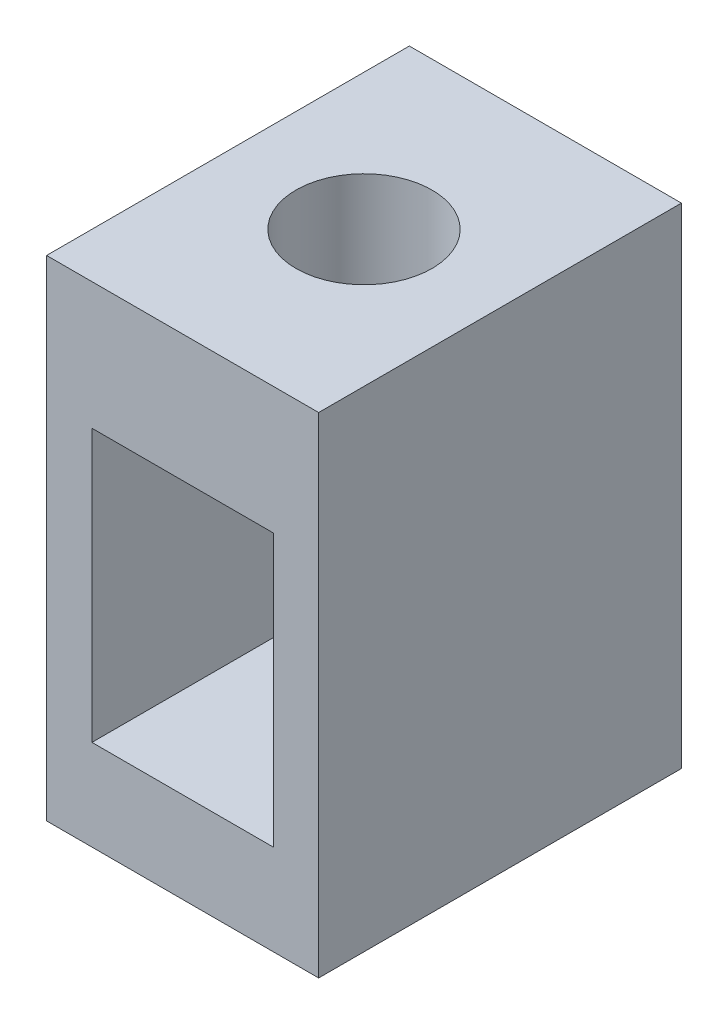
ISO-10303-21;
HEADER;
FILE_DESCRIPTION(('STEP AP214'),'2;1');
FILE_NAME('part.step','',(''),(''),'','','');
FILE_SCHEMA(('AUTOMOTIVE_DESIGN { 1 0 10303 214 1 1 1 1 }'));
ENDSEC;
DATA;
#1=APPLICATION_CONTEXT('core data for automotive mechanical design processes');
#2=APPLICATION_PROTOCOL_DEFINITION('international standard','automotive_design',2000,#1);
#3=PRODUCT_CONTEXT('',#1,'mechanical');
#4=PRODUCT('Part','Part','',(#3));
#5=PRODUCT_RELATED_PRODUCT_CATEGORY('part','',(#4));
#6=PRODUCT_DEFINITION_FORMATION('','',#4);
#7=PRODUCT_DEFINITION_CONTEXT('part definition',#1,'design');
#8=PRODUCT_DEFINITION('design','',#6,#7);
#9=PRODUCT_DEFINITION_SHAPE('','',#8);
#10=(LENGTH_UNIT() NAMED_UNIT(*) SI_UNIT(.MILLI.,.METRE.));
#11=(NAMED_UNIT(*) PLANE_ANGLE_UNIT() SI_UNIT($,.RADIAN.));
#12=(NAMED_UNIT(*) SI_UNIT($,.STERADIAN.) SOLID_ANGLE_UNIT());
#13=UNCERTAINTY_MEASURE_WITH_UNIT(LENGTH_MEASURE(1.E-05),#10,'distance_accuracy_value','');
#14=(GEOMETRIC_REPRESENTATION_CONTEXT(3) GLOBAL_UNCERTAINTY_ASSIGNED_CONTEXT((#13)) GLOBAL_UNIT_ASSIGNED_CONTEXT((#10,
#11,#12)) REPRESENTATION_CONTEXT('',''));
#15=CARTESIAN_POINT('',(0.,0.,0.));
#16=DIRECTION('',(0.,0.,1.));
#17=DIRECTION('',(1.,0.,0.));
#18=AXIS2_PLACEMENT_3D('',#15,#16,#17);
#19=CARTESIAN_POINT('',(1.5,2.7,-4.));
#20=DIRECTION('',(1.,0.,0.));
#21=DIRECTION('',(0.,1.,0.));
#22=AXIS2_PLACEMENT_3D('',#19,#20,#21);
#23=PLANE('',#22);
#24=DIRECTION('',(0.,1.,0.));
#25=VECTOR('',#24,1.);
#26=CARTESIAN_POINT('',(1.5,2.7,0.));
#27=LINE('',#26,#25);
#28=CARTESIAN_POINT('',(1.5,-2.7,0.));
#29=VERTEX_POINT('',#28);
#30=CARTESIAN_POINT('',(1.5,2.7,0.));
#31=VERTEX_POINT('',#30);
#32=EDGE_CURVE('E136',#29,#31,#27,.T.);
#33=ORIENTED_EDGE('',*,*,#32,.F.);
#34=DIRECTION('',(0.,0.,1.));
#35=VECTOR('',#34,1.);
#36=CARTESIAN_POINT('',(1.5,-2.7,-4.));
#37=LINE('',#36,#35);
#38=CARTESIAN_POINT('',(1.5,-2.7,-4.));
#39=VERTEX_POINT('',#38);
#40=EDGE_CURVE('E11',#39,#29,#37,.T.);
#41=ORIENTED_EDGE('',*,*,#40,.F.);
#42=DIRECTION('',(0.,1.,0.));
#43=VECTOR('',#42,1.);
#44=CARTESIAN_POINT('',(1.5,2.7,-4.));
#45=LINE('',#44,#43);
#46=CARTESIAN_POINT('',(1.5,2.7,-4.));
#47=VERTEX_POINT('',#46);
#48=EDGE_CURVE('E140',#39,#47,#45,.T.);
#49=ORIENTED_EDGE('',*,*,#48,.T.);
#50=DIRECTION('',(0.,0.,1.));
#51=VECTOR('',#50,1.);
#52=CARTESIAN_POINT('',(1.5,2.7,-4.));
#53=LINE('',#52,#51);
#54=EDGE_CURVE('E38',#47,#31,#53,.T.);
#55=ORIENTED_EDGE('',*,*,#54,.T.);
#56=EDGE_LOOP('',(#33,#41,#49,#55));
#57=FACE_BOUND('',#56,.T.);
#58=ADVANCED_FACE('F35',(#57),#23,.T.);
#59=CARTESIAN_POINT('',(-1.5,-2.7,-4.));
#60=DIRECTION('',(0.,-1.,0.));
#61=DIRECTION('',(0.,0.,-1.));
#62=AXIS2_PLACEMENT_3D('',#59,#60,#61);
#63=PLANE('',#62);
#64=DIRECTION('',(1.,0.,0.));
#65=VECTOR('',#64,1.);
#66=CARTESIAN_POINT('',(-1.5,-2.7,0.));
#67=LINE('',#66,#65);
#68=CARTESIAN_POINT('',(-1.5,-2.7,0.));
#69=VERTEX_POINT('',#68);
#70=EDGE_CURVE('E144',#69,#29,#67,.T.);
#71=ORIENTED_EDGE('',*,*,#70,.F.);
#72=DIRECTION('',(0.,0.,1.));
#73=VECTOR('',#72,1.);
#74=CARTESIAN_POINT('',(-1.5,-2.7,-4.));
#75=LINE('',#74,#73);
#76=CARTESIAN_POINT('',(-1.5,-2.7,-4.));
#77=VERTEX_POINT('',#76);
#78=EDGE_CURVE('E43',#77,#69,#75,.T.);
#79=ORIENTED_EDGE('',*,*,#78,.F.);
#80=DIRECTION('',(1.,0.,0.));
#81=VECTOR('',#80,1.);
#82=CARTESIAN_POINT('',(-1.5,-2.7,-4.));
#83=LINE('',#82,#81);
#84=EDGE_CURVE('E150',#77,#39,#83,.T.);
#85=ORIENTED_EDGE('',*,*,#84,.T.);
#86=ORIENTED_EDGE('',*,*,#40,.T.);
#87=EDGE_LOOP('',(#71,#79,#85,#86));
#88=FACE_BOUND('',#87,.T.);
#89=ADVANCED_FACE('F176',(#88),#63,.T.);
#90=CARTESIAN_POINT('',(-1.5,2.7,-4.));
#91=DIRECTION('',(-1.,0.,0.));
#92=DIRECTION('',(0.,-1.,0.));
#93=AXIS2_PLACEMENT_3D('',#90,#91,#92);
#94=PLANE('',#93);
#95=DIRECTION('',(0.,-1.,0.));
#96=VECTOR('',#95,1.);
#97=CARTESIAN_POINT('',(-1.5,2.7,0.));
#98=LINE('',#97,#96);
#99=CARTESIAN_POINT('',(-1.5,2.7,0.));
#100=VERTEX_POINT('',#99);
#101=EDGE_CURVE('E158',#100,#69,#98,.T.);
#102=ORIENTED_EDGE('',*,*,#101,.F.);
#103=DIRECTION('',(0.,0.,1.));
#104=VECTOR('',#103,1.);
#105=CARTESIAN_POINT('',(-1.5,2.7,-4.));
#106=LINE('',#105,#104);
#107=CARTESIAN_POINT('',(-1.5,2.7,-4.));
#108=VERTEX_POINT('',#107);
#109=EDGE_CURVE('E163',#108,#100,#106,.T.);
#110=ORIENTED_EDGE('',*,*,#109,.F.);
#111=DIRECTION('',(0.,-1.,0.));
#112=VECTOR('',#111,1.);
#113=CARTESIAN_POINT('',(-1.5,2.7,-4.));
#114=LINE('',#113,#112);
#115=EDGE_CURVE('E147',#108,#77,#114,.T.);
#116=ORIENTED_EDGE('',*,*,#115,.T.);
#117=ORIENTED_EDGE('',*,*,#78,.T.);
#118=EDGE_LOOP('',(#102,#110,#116,#117));
#119=FACE_BOUND('',#118,.T.);
#120=ADVANCED_FACE('F180',(#119),#94,.T.);
#121=CARTESIAN_POINT('',(-1.5,2.7,-4.));
#122=DIRECTION('',(0.,1.,0.));
#123=DIRECTION('',(0.,0.,1.));
#124=AXIS2_PLACEMENT_3D('',#121,#122,#123);
#125=PLANE('',#124);
#126=CARTESIAN_POINT('',(0.,2.7,-2.));
#127=DIRECTION('',(0.,1.,0.));
#128=DIRECTION('',(0.,0.,1.));
#129=AXIS2_PLACEMENT_3D('',#126,#127,#128);
#130=CIRCLE('',#129,0.75);
#131=CARTESIAN_POINT('',(0.,2.7,-1.25));
#132=VERTEX_POINT('',#131);
#133=EDGE_CURVE('E275',#132,#132,#130,.T.);
#134=ORIENTED_EDGE('',*,*,#133,.F.);
#135=EDGE_LOOP('',(#134));
#136=FACE_BOUND('',#135,.T.);
#137=DIRECTION('',(-1.,0.,0.));
#138=VECTOR('',#137,1.);
#139=CARTESIAN_POINT('',(-1.5,2.7,0.));
#140=LINE('',#139,#138);
#141=EDGE_CURVE('E155',#31,#100,#140,.T.);
#142=ORIENTED_EDGE('',*,*,#141,.F.);
#143=ORIENTED_EDGE('',*,*,#54,.F.);
#144=DIRECTION('',(-1.,0.,0.));
#145=VECTOR('',#144,1.);
#146=CARTESIAN_POINT('',(-1.5,2.7,-4.));
#147=LINE('',#146,#145);
#148=EDGE_CURVE('E143',#47,#108,#147,.T.);
#149=ORIENTED_EDGE('',*,*,#148,.T.);
#150=ORIENTED_EDGE('',*,*,#109,.T.);
#151=EDGE_LOOP('',(#142,#143,#149,#150));
#152=FACE_BOUND('',#151,.T.);
#153=ADVANCED_FACE('F171',(#136,#152),#125,.T.);
#154=CARTESIAN_POINT('',(0.,0.,-4.));
#155=DIRECTION('',(0.,0.,1.));
#156=DIRECTION('',(1.,0.,0.));
#157=AXIS2_PLACEMENT_3D('',#154,#155,#156);
#158=PLANE('',#157);
#159=DIRECTION('',(-1.,0.,0.));
#160=VECTOR('',#159,1.);
#161=CARTESIAN_POINT('',(-1.,1.3,-4.));
#162=LINE('',#161,#160);
#163=CARTESIAN_POINT('',(0.999999999999999,1.3,-4.));
#164=VERTEX_POINT('',#163);
#165=CARTESIAN_POINT('',(-1.,1.3,-4.));
#166=VERTEX_POINT('',#165);
#167=EDGE_CURVE('E108',#164,#166,#162,.T.);
#168=ORIENTED_EDGE('',*,*,#167,.T.);
#169=DIRECTION('',(0.,-1.,0.));
#170=VECTOR('',#169,1.);
#171=CARTESIAN_POINT('',(-1.,1.3,-4.));
#172=LINE('',#171,#170);
#173=CARTESIAN_POINT('',(-1.,-1.7,-4.));
#174=VERTEX_POINT('',#173);
#175=EDGE_CURVE('E102',#166,#174,#172,.T.);
#176=ORIENTED_EDGE('',*,*,#175,.T.);
#177=DIRECTION('',(1.,0.,0.));
#178=VECTOR('',#177,1.);
#179=CARTESIAN_POINT('',(-1.,-1.7,-4.));
#180=LINE('',#179,#178);
#181=CARTESIAN_POINT('',(1.,-1.7,-4.));
#182=VERTEX_POINT('',#181);
#183=EDGE_CURVE('E111',#174,#182,#180,.T.);
#184=ORIENTED_EDGE('',*,*,#183,.T.);
#185=DIRECTION('',(0.,1.,0.));
#186=VECTOR('',#185,1.);
#187=CARTESIAN_POINT('',(0.999999999999999,1.3,-4.));
#188=LINE('',#187,#186);
#189=EDGE_CURVE('E51',#182,#164,#188,.T.);
#190=ORIENTED_EDGE('',*,*,#189,.T.);
#191=EDGE_LOOP('',(#168,#176,#184,#190));
#192=FACE_BOUND('',#191,.T.);
#193=ORIENTED_EDGE('',*,*,#48,.F.);
#194=ORIENTED_EDGE('',*,*,#84,.F.);
#195=ORIENTED_EDGE('',*,*,#115,.F.);
#196=ORIENTED_EDGE('',*,*,#148,.F.);
#197=EDGE_LOOP('',(#193,#194,#195,#196));
#198=FACE_BOUND('',#197,.T.);
#199=ADVANCED_FACE('F115',(#192,#198),#158,.F.);
#200=CARTESIAN_POINT('',(0.,0.,0.));
#201=DIRECTION('',(0.,0.,1.));
#202=DIRECTION('',(1.,0.,0.));
#203=AXIS2_PLACEMENT_3D('',#200,#201,#202);
#204=PLANE('',#203);
#205=DIRECTION('',(0.,-1.,0.));
#206=VECTOR('',#205,1.);
#207=CARTESIAN_POINT('',(-1.,1.3,0.));
#208=LINE('',#207,#206);
#209=CARTESIAN_POINT('',(-1.,1.3,0.));
#210=VERTEX_POINT('',#209);
#211=CARTESIAN_POINT('',(-1.,-1.7,0.));
#212=VERTEX_POINT('',#211);
#213=EDGE_CURVE('E59',#210,#212,#208,.T.);
#214=ORIENTED_EDGE('',*,*,#213,.F.);
#215=DIRECTION('',(-1.,0.,0.));
#216=VECTOR('',#215,1.);
#217=CARTESIAN_POINT('',(-1.,1.3,0.));
#218=LINE('',#217,#216);
#219=CARTESIAN_POINT('',(0.999999999999999,1.3,0.));
#220=VERTEX_POINT('',#219);
#221=EDGE_CURVE('E118',#220,#210,#218,.T.);
#222=ORIENTED_EDGE('',*,*,#221,.F.);
#223=DIRECTION('',(0.,1.,0.));
#224=VECTOR('',#223,1.);
#225=CARTESIAN_POINT('',(0.999999999999999,1.3,0.));
#226=LINE('',#225,#224);
#227=CARTESIAN_POINT('',(1.,-1.7,0.));
#228=VERTEX_POINT('',#227);
#229=EDGE_CURVE('E121',#228,#220,#226,.T.);
#230=ORIENTED_EDGE('',*,*,#229,.F.);
#231=DIRECTION('',(1.,0.,0.));
#232=VECTOR('',#231,1.);
#233=CARTESIAN_POINT('',(-1.,-1.7,0.));
#234=LINE('',#233,#232);
#235=EDGE_CURVE('E130',#212,#228,#234,.T.);
#236=ORIENTED_EDGE('',*,*,#235,.F.);
#237=EDGE_LOOP('',(#214,#222,#230,#236));
#238=FACE_BOUND('',#237,.T.);
#239=ORIENTED_EDGE('',*,*,#32,.T.);
#240=ORIENTED_EDGE('',*,*,#141,.T.);
#241=ORIENTED_EDGE('',*,*,#101,.T.);
#242=ORIENTED_EDGE('',*,*,#70,.T.);
#243=EDGE_LOOP('',(#239,#240,#241,#242));
#244=FACE_BOUND('',#243,.T.);
#245=ADVANCED_FACE('F173',(#238,#244),#204,.T.);
#246=CARTESIAN_POINT('',(-1.,1.3,-4.));
#247=DIRECTION('',(-1.,0.,0.));
#248=DIRECTION('',(0.,-1.,0.));
#249=AXIS2_PLACEMENT_3D('',#246,#247,#248);
#250=PLANE('',#249);
#251=ORIENTED_EDGE('',*,*,#213,.T.);
#252=DIRECTION('',(0.,0.,1.));
#253=VECTOR('',#252,1.);
#254=CARTESIAN_POINT('',(-1.,-1.7,-4.));
#255=LINE('',#254,#253);
#256=EDGE_CURVE('E98',#174,#212,#255,.T.);
#257=ORIENTED_EDGE('',*,*,#256,.F.);
#258=ORIENTED_EDGE('',*,*,#175,.F.);
#259=DIRECTION('',(0.,0.,1.));
#260=VECTOR('',#259,1.);
#261=CARTESIAN_POINT('',(-1.,1.3,-4.));
#262=LINE('',#261,#260);
#263=EDGE_CURVE('E134',#166,#210,#262,.T.);
#264=ORIENTED_EDGE('',*,*,#263,.T.);
#265=EDGE_LOOP('',(#251,#257,#258,#264));
#266=FACE_BOUND('',#265,.T.);
#267=ADVANCED_FACE('F100',(#266),#250,.F.);
#268=CARTESIAN_POINT('',(-1.,1.3,-4.));
#269=DIRECTION('',(0.,1.,0.));
#270=DIRECTION('',(0.,0.,1.));
#271=AXIS2_PLACEMENT_3D('',#268,#269,#270);
#272=PLANE('',#271);
#273=CARTESIAN_POINT('',(0.,1.3,-2.));
#274=DIRECTION('',(0.,1.,0.));
#275=DIRECTION('',(0.,0.,1.));
#276=AXIS2_PLACEMENT_3D('',#273,#274,#275);
#277=CIRCLE('',#276,0.75);
#278=CARTESIAN_POINT('',(0.,1.3,-1.25));
#279=VERTEX_POINT('',#278);
#280=EDGE_CURVE('E124',#279,#279,#277,.F.);
#281=ORIENTED_EDGE('',*,*,#280,.F.);
#282=EDGE_LOOP('',(#281));
#283=FACE_BOUND('',#282,.T.);
#284=ORIENTED_EDGE('',*,*,#221,.T.);
#285=ORIENTED_EDGE('',*,*,#263,.F.);
#286=ORIENTED_EDGE('',*,*,#167,.F.);
#287=DIRECTION('',(0.,0.,1.));
#288=VECTOR('',#287,1.);
#289=CARTESIAN_POINT('',(0.999999999999999,1.3,-4.));
#290=LINE('',#289,#288);
#291=EDGE_CURVE('E137',#164,#220,#290,.T.);
#292=ORIENTED_EDGE('',*,*,#291,.T.);
#293=EDGE_LOOP('',(#284,#285,#286,#292));
#294=FACE_BOUND('',#293,.T.);
#295=ADVANCED_FACE('F227',(#283,#294),#272,.F.);
#296=CARTESIAN_POINT('',(0.999999999999999,1.3,-4.));
#297=DIRECTION('',(1.,0.,0.));
#298=DIRECTION('',(0.,1.,0.));
#299=AXIS2_PLACEMENT_3D('',#296,#297,#298);
#300=PLANE('',#299);
#301=ORIENTED_EDGE('',*,*,#229,.T.);
#302=ORIENTED_EDGE('',*,*,#291,.F.);
#303=ORIENTED_EDGE('',*,*,#189,.F.);
#304=DIRECTION('',(0.,0.,1.));
#305=VECTOR('',#304,1.);
#306=CARTESIAN_POINT('',(1.,-1.7,-4.));
#307=LINE('',#306,#305);
#308=EDGE_CURVE('E107',#182,#228,#307,.T.);
#309=ORIENTED_EDGE('',*,*,#308,.T.);
#310=EDGE_LOOP('',(#301,#302,#303,#309));
#311=FACE_BOUND('',#310,.T.);
#312=ADVANCED_FACE('F234',(#311),#300,.F.);
#313=CARTESIAN_POINT('',(-1.,-1.7,-4.));
#314=DIRECTION('',(0.,-1.,0.));
#315=DIRECTION('',(0.,0.,-1.));
#316=AXIS2_PLACEMENT_3D('',#313,#314,#315);
#317=PLANE('',#316);
#318=ORIENTED_EDGE('',*,*,#235,.T.);
#319=ORIENTED_EDGE('',*,*,#308,.F.);
#320=ORIENTED_EDGE('',*,*,#183,.F.);
#321=ORIENTED_EDGE('',*,*,#256,.T.);
#322=EDGE_LOOP('',(#318,#319,#320,#321));
#323=FACE_BOUND('',#322,.T.);
#324=ADVANCED_FACE('F112',(#323),#317,.F.);
#325=CARTESIAN_POINT('',(0.,-2.701,-2.));
#326=DIRECTION('',(0.,1.,0.));
#327=DIRECTION('',(0.,0.,1.));
#328=AXIS2_PLACEMENT_3D('',#325,#326,#327);
#329=CYLINDRICAL_SURFACE('',#328,0.75);
#330=ORIENTED_EDGE('',*,*,#133,.T.);
#331=EDGE_LOOP('',(#330));
#332=FACE_BOUND('',#331,.T.);
#333=ORIENTED_EDGE('',*,*,#280,.T.);
#334=EDGE_LOOP('',(#333));
#335=FACE_BOUND('',#334,.T.);
#336=ADVANCED_FACE('F247',(#332,#335),#329,.F.);
#337=CLOSED_SHELL('',(#58,#89,#120,#153,#199,#245,#267,#295,#312,#324,#336));
#338=MANIFOLD_SOLID_BREP('B2',#337);
#339=ADVANCED_BREP_SHAPE_REPRESENTATION('',(#18,#338),#14);
#340=SHAPE_DEFINITION_REPRESENTATION(#9,#339);
ENDSEC;
END-ISO-10303-21;
